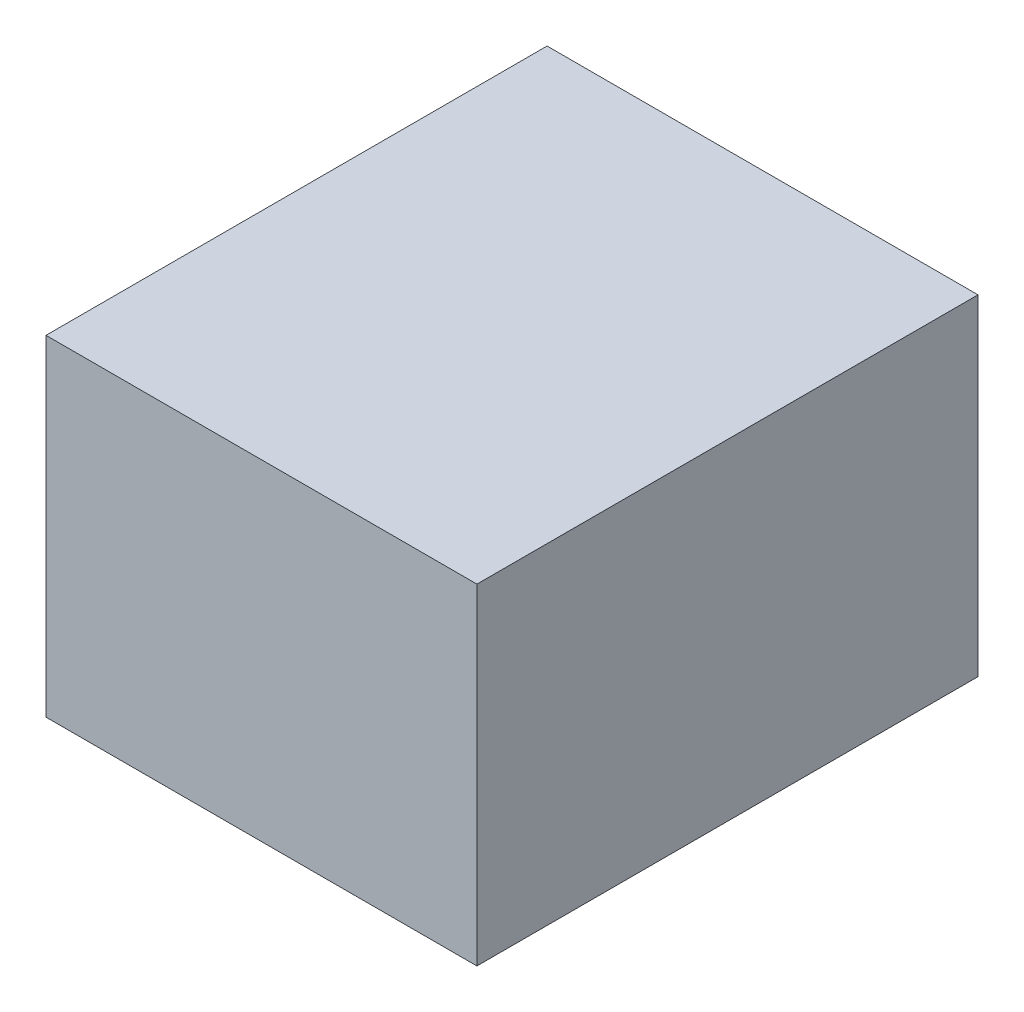
ISO-10303-21;
HEADER;
FILE_DESCRIPTION(('STEP AP214'),'2;1');
FILE_NAME('part.step','',(''),(''),'','','');
FILE_SCHEMA(('AUTOMOTIVE_DESIGN { 1 0 10303 214 1 1 1 1 }'));
ENDSEC;
DATA;
#1=APPLICATION_CONTEXT('core data for automotive mechanical design processes');
#2=APPLICATION_PROTOCOL_DEFINITION('international standard','automotive_design',2000,#1);
#3=PRODUCT_CONTEXT('',#1,'mechanical');
#4=PRODUCT('Part','Part','',(#3));
#5=PRODUCT_RELATED_PRODUCT_CATEGORY('part','',(#4));
#6=PRODUCT_DEFINITION_FORMATION('','',#4);
#7=PRODUCT_DEFINITION_CONTEXT('part definition',#1,'design');
#8=PRODUCT_DEFINITION('design','',#6,#7);
#9=PRODUCT_DEFINITION_SHAPE('','',#8);
#10=(LENGTH_UNIT() NAMED_UNIT(*) SI_UNIT(.MILLI.,.METRE.));
#11=(NAMED_UNIT(*) PLANE_ANGLE_UNIT() SI_UNIT($,.RADIAN.));
#12=(NAMED_UNIT(*) SI_UNIT($,.STERADIAN.) SOLID_ANGLE_UNIT());
#13=UNCERTAINTY_MEASURE_WITH_UNIT(LENGTH_MEASURE(1.E-05),#10,'distance_accuracy_value','');
#14=(GEOMETRIC_REPRESENTATION_CONTEXT(3) GLOBAL_UNCERTAINTY_ASSIGNED_CONTEXT((#13)) GLOBAL_UNIT_ASSIGNED_CONTEXT((#10,
#11,#12)) REPRESENTATION_CONTEXT('',''));
#15=CARTESIAN_POINT('',(0.,0.,0.));
#16=DIRECTION('',(0.,0.,1.));
#17=DIRECTION('',(1.,0.,0.));
#18=AXIS2_PLACEMENT_3D('',#15,#16,#17);
#19=CARTESIAN_POINT('',(-21.5,33.,25.));
#20=DIRECTION('',(1.,0.,0.));
#21=DIRECTION('',(0.,0.,-1.));
#22=AXIS2_PLACEMENT_3D('',#19,#20,#21);
#23=PLANE('',#22);
#24=DIRECTION('',(0.,0.,1.));
#25=VECTOR('',#24,1.);
#26=CARTESIAN_POINT('',(-21.5,0.,25.));
#27=LINE('',#26,#25);
#28=CARTESIAN_POINT('',(-21.5,0.,-25.));
#29=VERTEX_POINT('',#28);
#30=CARTESIAN_POINT('',(-21.5,0.,25.));
#31=VERTEX_POINT('',#30);
#32=EDGE_CURVE('E96',#29,#31,#27,.T.);
#33=ORIENTED_EDGE('',*,*,#32,.T.);
#34=DIRECTION('',(0.,-1.,0.));
#35=VECTOR('',#34,1.);
#36=CARTESIAN_POINT('',(-21.5,33.,25.));
#37=LINE('',#36,#35);
#38=CARTESIAN_POINT('',(-21.5,33.,25.));
#39=VERTEX_POINT('',#38);
#40=EDGE_CURVE('E11',#39,#31,#37,.T.);
#41=ORIENTED_EDGE('',*,*,#40,.F.);
#42=DIRECTION('',(0.,0.,1.));
#43=VECTOR('',#42,1.);
#44=CARTESIAN_POINT('',(-21.5,33.,25.));
#45=LINE('',#44,#43);
#46=CARTESIAN_POINT('',(-21.5,33.,-25.));
#47=VERTEX_POINT('',#46);
#48=EDGE_CURVE('E84',#47,#39,#45,.T.);
#49=ORIENTED_EDGE('',*,*,#48,.F.);
#50=DIRECTION('',(0.,-1.,0.));
#51=VECTOR('',#50,1.);
#52=CARTESIAN_POINT('',(-21.5,33.,-25.));
#53=LINE('',#52,#51);
#54=EDGE_CURVE('E92',#47,#29,#53,.T.);
#55=ORIENTED_EDGE('',*,*,#54,.T.);
#56=EDGE_LOOP('',(#33,#41,#49,#55));
#57=FACE_BOUND('',#56,.T.);
#58=ADVANCED_FACE('F33',(#57),#23,.F.);
#59=CARTESIAN_POINT('',(21.5,33.,25.));
#60=DIRECTION('',(0.,0.,-1.));
#61=DIRECTION('',(-1.,0.,0.));
#62=AXIS2_PLACEMENT_3D('',#59,#60,#61);
#63=PLANE('',#62);
#64=DIRECTION('',(1.,0.,0.));
#65=VECTOR('',#64,1.);
#66=CARTESIAN_POINT('',(21.5,0.,25.));
#67=LINE('',#66,#65);
#68=CARTESIAN_POINT('',(21.5,0.,25.));
#69=VERTEX_POINT('',#68);
#70=EDGE_CURVE('E88',#31,#69,#67,.T.);
#71=ORIENTED_EDGE('',*,*,#70,.T.);
#72=DIRECTION('',(0.,-1.,0.));
#73=VECTOR('',#72,1.);
#74=CARTESIAN_POINT('',(21.5,33.,25.));
#75=LINE('',#74,#73);
#76=CARTESIAN_POINT('',(21.5,33.,25.));
#77=VERTEX_POINT('',#76);
#78=EDGE_CURVE('E41',#77,#69,#75,.T.);
#79=ORIENTED_EDGE('',*,*,#78,.F.);
#80=DIRECTION('',(1.,0.,0.));
#81=VECTOR('',#80,1.);
#82=CARTESIAN_POINT('',(21.5,33.,25.));
#83=LINE('',#82,#81);
#84=EDGE_CURVE('E79',#39,#77,#83,.T.);
#85=ORIENTED_EDGE('',*,*,#84,.F.);
#86=ORIENTED_EDGE('',*,*,#40,.T.);
#87=EDGE_LOOP('',(#71,#79,#85,#86));
#88=FACE_BOUND('',#87,.T.);
#89=ADVANCED_FACE('F87',(#88),#63,.F.);
#90=CARTESIAN_POINT('',(21.5,33.,25.));
#91=DIRECTION('',(-1.,0.,0.));
#92=DIRECTION('',(0.,0.,1.));
#93=AXIS2_PLACEMENT_3D('',#90,#91,#92);
#94=PLANE('',#93);
#95=DIRECTION('',(0.,0.,-1.));
#96=VECTOR('',#95,1.);
#97=CARTESIAN_POINT('',(21.5,0.,25.));
#98=LINE('',#97,#96);
#99=CARTESIAN_POINT('',(21.5,0.,-25.));
#100=VERTEX_POINT('',#99);
#101=EDGE_CURVE('E66',#69,#100,#98,.T.);
#102=ORIENTED_EDGE('',*,*,#101,.T.);
#103=DIRECTION('',(0.,-1.,0.));
#104=VECTOR('',#103,1.);
#105=CARTESIAN_POINT('',(21.5,33.,-25.));
#106=LINE('',#105,#104);
#107=CARTESIAN_POINT('',(21.5,33.,-25.));
#108=VERTEX_POINT('',#107);
#109=EDGE_CURVE('E89',#108,#100,#106,.T.);
#110=ORIENTED_EDGE('',*,*,#109,.F.);
#111=DIRECTION('',(0.,0.,-1.));
#112=VECTOR('',#111,1.);
#113=CARTESIAN_POINT('',(21.5,33.,25.));
#114=LINE('',#113,#112);
#115=EDGE_CURVE('E82',#77,#108,#114,.T.);
#116=ORIENTED_EDGE('',*,*,#115,.F.);
#117=ORIENTED_EDGE('',*,*,#78,.T.);
#118=EDGE_LOOP('',(#102,#110,#116,#117));
#119=FACE_BOUND('',#118,.T.);
#120=ADVANCED_FACE('F90',(#119),#94,.F.);
#121=CARTESIAN_POINT('',(21.5,33.,-25.));
#122=DIRECTION('',(0.,0.,1.));
#123=DIRECTION('',(1.,0.,0.));
#124=AXIS2_PLACEMENT_3D('',#121,#122,#123);
#125=PLANE('',#124);
#126=DIRECTION('',(-1.,0.,0.));
#127=VECTOR('',#126,1.);
#128=CARTESIAN_POINT('',(21.5,0.,-25.));
#129=LINE('',#128,#127);
#130=EDGE_CURVE('E72',#100,#29,#129,.T.);
#131=ORIENTED_EDGE('',*,*,#130,.T.);
#132=ORIENTED_EDGE('',*,*,#54,.F.);
#133=DIRECTION('',(-1.,0.,0.));
#134=VECTOR('',#133,1.);
#135=CARTESIAN_POINT('',(21.5,33.,-25.));
#136=LINE('',#135,#134);
#137=EDGE_CURVE('E49',#108,#47,#136,.T.);
#138=ORIENTED_EDGE('',*,*,#137,.F.);
#139=ORIENTED_EDGE('',*,*,#109,.T.);
#140=EDGE_LOOP('',(#131,#132,#138,#139));
#141=FACE_BOUND('',#140,.T.);
#142=ADVANCED_FACE('F103',(#141),#125,.F.);
#143=CARTESIAN_POINT('',(0.,33.,0.));
#144=DIRECTION('',(0.,1.,0.));
#145=DIRECTION('',(0.,0.,1.));
#146=AXIS2_PLACEMENT_3D('',#143,#144,#145);
#147=PLANE('',#146);
#148=ORIENTED_EDGE('',*,*,#48,.T.);
#149=ORIENTED_EDGE('',*,*,#84,.T.);
#150=ORIENTED_EDGE('',*,*,#115,.T.);
#151=ORIENTED_EDGE('',*,*,#137,.T.);
#152=EDGE_LOOP('',(#148,#149,#150,#151));
#153=FACE_BOUND('',#152,.T.);
#154=ADVANCED_FACE('F80',(#153),#147,.T.);
#155=CARTESIAN_POINT('',(0.,0.,0.));
#156=DIRECTION('',(0.,1.,0.));
#157=DIRECTION('',(0.,0.,1.));
#158=AXIS2_PLACEMENT_3D('',#155,#156,#157);
#159=PLANE('',#158);
#160=ORIENTED_EDGE('',*,*,#32,.F.);
#161=ORIENTED_EDGE('',*,*,#130,.F.);
#162=ORIENTED_EDGE('',*,*,#101,.F.);
#163=ORIENTED_EDGE('',*,*,#70,.F.);
#164=EDGE_LOOP('',(#160,#161,#162,#163));
#165=FACE_BOUND('',#164,.T.);
#166=ADVANCED_FACE('F106',(#165),#159,.F.);
#167=CLOSED_SHELL('',(#58,#89,#120,#142,#154,#166));
#168=MANIFOLD_SOLID_BREP('B2',#167);
#169=ADVANCED_BREP_SHAPE_REPRESENTATION('',(#18,#168),#14);
#170=SHAPE_DEFINITION_REPRESENTATION(#9,#169);
ENDSEC;
END-ISO-10303-21;
